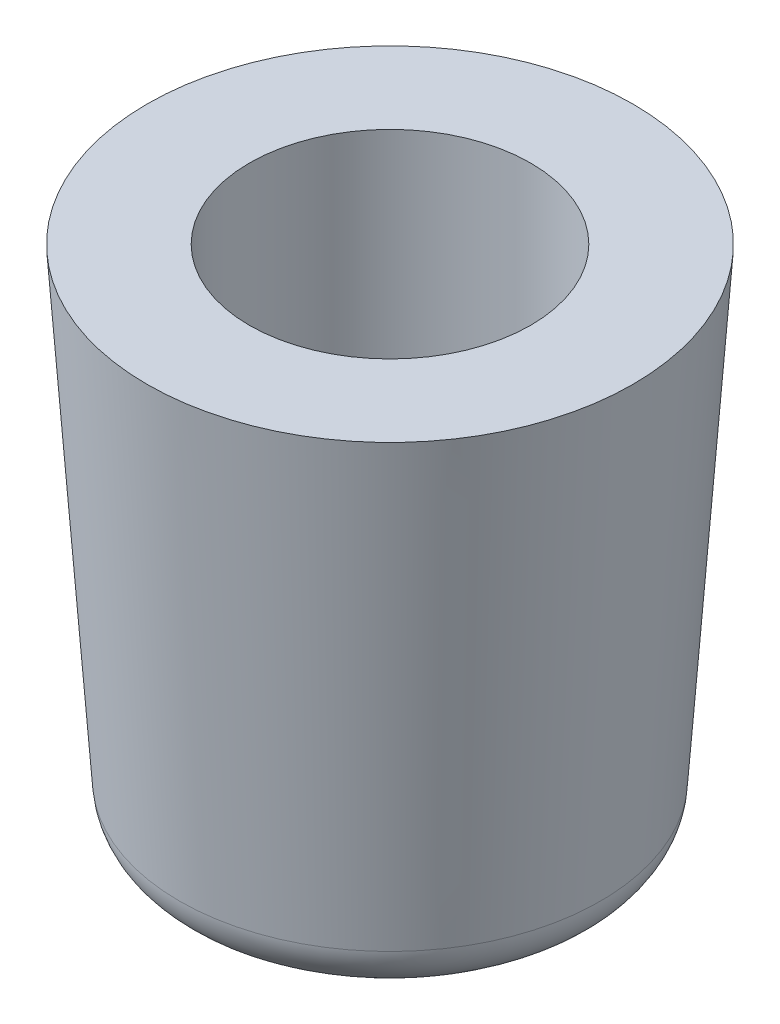
ISO-10303-21;
HEADER;
FILE_DESCRIPTION(('STEP AP214'),'2;1');
FILE_NAME('part.step','',(''),(''),'','','');
FILE_SCHEMA(('AUTOMOTIVE_DESIGN { 1 0 10303 214 1 1 1 1 }'));
ENDSEC;
DATA;
#1=APPLICATION_CONTEXT('core data for automotive mechanical design processes');
#2=APPLICATION_PROTOCOL_DEFINITION('international standard','automotive_design',2000,#1);
#3=PRODUCT_CONTEXT('',#1,'mechanical');
#4=PRODUCT('Part','Part','',(#3));
#5=PRODUCT_RELATED_PRODUCT_CATEGORY('part','',(#4));
#6=PRODUCT_DEFINITION_FORMATION('','',#4);
#7=PRODUCT_DEFINITION_CONTEXT('part definition',#1,'design');
#8=PRODUCT_DEFINITION('design','',#6,#7);
#9=PRODUCT_DEFINITION_SHAPE('','',#8);
#10=(LENGTH_UNIT() NAMED_UNIT(*) SI_UNIT(.MILLI.,.METRE.));
#11=(NAMED_UNIT(*) PLANE_ANGLE_UNIT() SI_UNIT($,.RADIAN.));
#12=(NAMED_UNIT(*) SI_UNIT($,.STERADIAN.) SOLID_ANGLE_UNIT());
#13=UNCERTAINTY_MEASURE_WITH_UNIT(LENGTH_MEASURE(1.E-05),#10,'distance_accuracy_value','');
#14=(GEOMETRIC_REPRESENTATION_CONTEXT(3) GLOBAL_UNCERTAINTY_ASSIGNED_CONTEXT((#13)) GLOBAL_UNIT_ASSIGNED_CONTEXT((#10,
#11,#12)) REPRESENTATION_CONTEXT('',''));
#15=CARTESIAN_POINT('',(0.,0.,0.));
#16=DIRECTION('',(0.,0.,1.));
#17=DIRECTION('',(1.,0.,0.));
#18=AXIS2_PLACEMENT_3D('',#15,#16,#17);
#19=CARTESIAN_POINT('',(0.,0.,0.));
#20=DIRECTION('',(0.,1.,0.));
#21=DIRECTION('',(0.,0.,1.));
#22=AXIS2_PLACEMENT_3D('',#19,#20,#21);
#23=CONICAL_SURFACE('',#22,4.75,0.0698131700797732);
#24=CARTESIAN_POINT('',(0.,-9.06975647374412,0.));
#25=DIRECTION('',(0.,1.,0.));
#26=DIRECTION('',(0.,0.,1.));
#27=AXIS2_PLACEMENT_3D('',#24,#25,#26);
#28=CIRCLE('',#27,4.11578084468706);
#29=CARTESIAN_POINT('',(0.,-9.06975647374412,4.11578084468706));
#30=VERTEX_POINT('',#29);
#31=EDGE_CURVE('E44',#30,#30,#28,.T.);
#32=ORIENTED_EDGE('',*,*,#31,.T.);
#33=EDGE_LOOP('',(#32));
#34=FACE_BOUND('',#33,.T.);
#35=CARTESIAN_POINT('',(0.,0.,0.));
#36=DIRECTION('',(0.,1.,0.));
#37=DIRECTION('',(0.,0.,1.));
#38=AXIS2_PLACEMENT_3D('',#35,#36,#37);
#39=CIRCLE('',#38,4.75);
#40=CARTESIAN_POINT('',(0.,0.,4.75));
#41=VERTEX_POINT('',#40);
#42=EDGE_CURVE('E48',#41,#41,#39,.T.);
#43=ORIENTED_EDGE('',*,*,#42,.F.);
#44=EDGE_LOOP('',(#43));
#45=FACE_BOUND('',#44,.T.);
#46=ADVANCED_FACE('F37',(#34,#45),#23,.T.);
#47=CARTESIAN_POINT('',(0.,-10.,0.));
#48=DIRECTION('',(0.,1.,0.));
#49=DIRECTION('',(0.,0.,1.));
#50=AXIS2_PLACEMENT_3D('',#47,#48,#49);
#51=PLANE('',#50);
#52=CARTESIAN_POINT('',(0.,-10.,0.));
#53=DIRECTION('',(0.,1.,0.));
#54=DIRECTION('',(0.,0.,1.));
#55=AXIS2_PLACEMENT_3D('',#52,#53,#54);
#56=CIRCLE('',#55,3.11821679442723);
#57=CARTESIAN_POINT('',(0.,-10.,3.11821679442723));
#58=VERTEX_POINT('',#57);
#59=EDGE_CURVE('E10',#58,#58,#56,.F.);
#60=ORIENTED_EDGE('',*,*,#59,.T.);
#61=EDGE_LOOP('',(#60));
#62=FACE_BOUND('',#61,.T.);
#63=ADVANCED_FACE('F72',(#62),#51,.F.);
#64=CARTESIAN_POINT('',(0.,0.,0.));
#65=DIRECTION('',(0.,1.,0.));
#66=DIRECTION('',(0.,0.,1.));
#67=AXIS2_PLACEMENT_3D('',#64,#65,#66);
#68=PLANE('',#67);
#69=CARTESIAN_POINT('',(0.,0.,0.));
#70=DIRECTION('',(0.,1.,0.));
#71=DIRECTION('',(0.,0.,1.));
#72=AXIS2_PLACEMENT_3D('',#69,#70,#71);
#73=CIRCLE('',#72,2.75);
#74=CARTESIAN_POINT('',(0.,0.,2.75));
#75=VERTEX_POINT('',#74);
#76=EDGE_CURVE('E55',#75,#75,#73,.T.);
#77=ORIENTED_EDGE('',*,*,#76,.F.);
#78=EDGE_LOOP('',(#77));
#79=FACE_BOUND('',#78,.T.);
#80=ORIENTED_EDGE('',*,*,#42,.T.);
#81=EDGE_LOOP('',(#80));
#82=FACE_BOUND('',#81,.T.);
#83=ADVANCED_FACE('F66',(#79,#82),#68,.T.);
#84=CARTESIAN_POINT('',(0.,-4.,0.));
#85=DIRECTION('',(0.,1.,0.));
#86=DIRECTION('',(0.,0.,1.));
#87=AXIS2_PLACEMENT_3D('',#84,#85,#86);
#88=CYLINDRICAL_SURFACE('',#87,2.75);
#89=CARTESIAN_POINT('',(0.,-4.,0.));
#90=DIRECTION('',(0.,1.,0.));
#91=DIRECTION('',(0.,0.,1.));
#92=AXIS2_PLACEMENT_3D('',#89,#90,#91);
#93=CIRCLE('',#92,2.75);
#94=CARTESIAN_POINT('',(0.,-4.,2.75));
#95=VERTEX_POINT('',#94);
#96=EDGE_CURVE('E52',#95,#95,#93,.T.);
#97=ORIENTED_EDGE('',*,*,#96,.F.);
#98=EDGE_LOOP('',(#97));
#99=FACE_BOUND('',#98,.T.);
#100=ORIENTED_EDGE('',*,*,#76,.T.);
#101=EDGE_LOOP('',(#100));
#102=FACE_BOUND('',#101,.T.);
#103=ADVANCED_FACE('F63',(#99,#102),#88,.F.);
#104=CARTESIAN_POINT('',(0.,-4.,0.));
#105=DIRECTION('',(0.,1.,0.));
#106=DIRECTION('',(0.,0.,1.));
#107=AXIS2_PLACEMENT_3D('',#104,#105,#106);
#108=PLANE('',#107);
#109=ORIENTED_EDGE('',*,*,#96,.T.);
#110=EDGE_LOOP('',(#109));
#111=FACE_BOUND('',#110,.T.);
#112=ADVANCED_FACE('F61',(#111),#108,.T.);
#113=CARTESIAN_POINT('',(0.,-9.,0.));
#114=DIRECTION('',(0.,1.,0.));
#115=DIRECTION('',(0.,0.,1.));
#116=AXIS2_PLACEMENT_3D('',#113,#114,#115);
#117=TOROIDAL_SURFACE('',#116,3.11821679442723,1.);
#118=ORIENTED_EDGE('',*,*,#59,.F.);
#119=EDGE_LOOP('',(#118));
#120=FACE_BOUND('',#119,.T.);
#121=ORIENTED_EDGE('',*,*,#31,.F.);
#122=EDGE_LOOP('',(#121));
#123=FACE_BOUND('',#122,.T.);
#124=ADVANCED_FACE('F39',(#120,#123),#117,.T.);
#125=CLOSED_SHELL('',(#46,#63,#83,#103,#112,#124));
#126=MANIFOLD_SOLID_BREP('B2',#125);
#127=ADVANCED_BREP_SHAPE_REPRESENTATION('',(#18,#126),#14);
#128=SHAPE_DEFINITION_REPRESENTATION(#9,#127);
ENDSEC;
END-ISO-10303-21;
